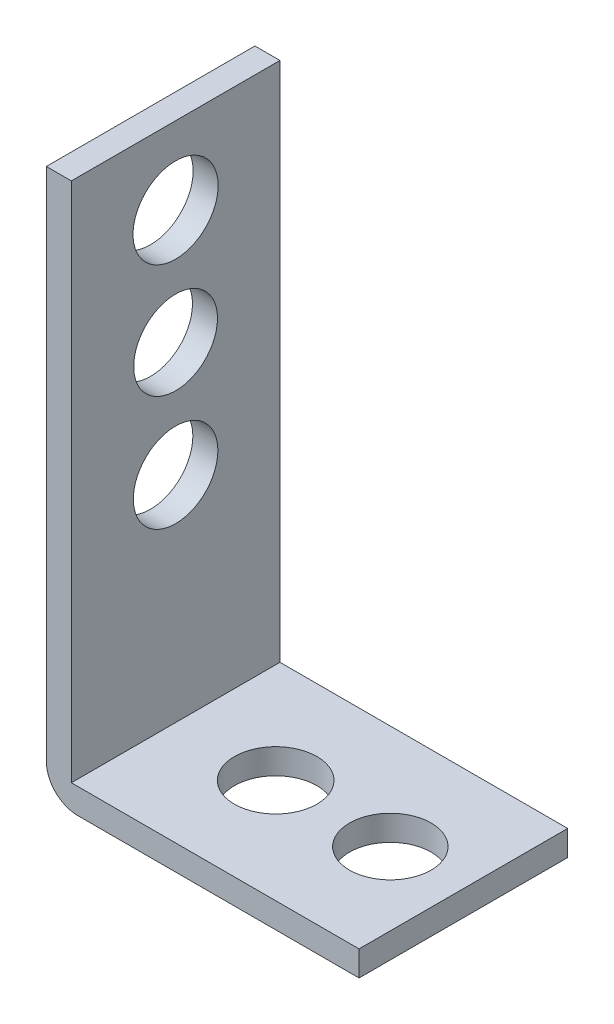
ISO-10303-21;
HEADER;
FILE_DESCRIPTION(('STEP AP214'),'2;1');
FILE_NAME('part.step','',(''),(''),'','','');
FILE_SCHEMA(('AUTOMOTIVE_DESIGN { 1 0 10303 214 1 1 1 1 }'));
ENDSEC;
DATA;
#1=APPLICATION_CONTEXT('core data for automotive mechanical design processes');
#2=APPLICATION_PROTOCOL_DEFINITION('international standard','automotive_design',2000,#1);
#3=PRODUCT_CONTEXT('',#1,'mechanical');
#4=PRODUCT('Part','Part','',(#3));
#5=PRODUCT_RELATED_PRODUCT_CATEGORY('part','',(#4));
#6=PRODUCT_DEFINITION_FORMATION('','',#4);
#7=PRODUCT_DEFINITION_CONTEXT('part definition',#1,'design');
#8=PRODUCT_DEFINITION('design','',#6,#7);
#9=PRODUCT_DEFINITION_SHAPE('','',#8);
#10=(LENGTH_UNIT() NAMED_UNIT(*) SI_UNIT(.MILLI.,.METRE.));
#11=(NAMED_UNIT(*) PLANE_ANGLE_UNIT() SI_UNIT($,.RADIAN.));
#12=(NAMED_UNIT(*) SI_UNIT($,.STERADIAN.) SOLID_ANGLE_UNIT());
#13=UNCERTAINTY_MEASURE_WITH_UNIT(LENGTH_MEASURE(1.E-05),#10,'distance_accuracy_value','');
#14=(GEOMETRIC_REPRESENTATION_CONTEXT(3) GLOBAL_UNCERTAINTY_ASSIGNED_CONTEXT((#13)) GLOBAL_UNIT_ASSIGNED_CONTEXT((#10,
#11,#12)) REPRESENTATION_CONTEXT('',''));
#15=CARTESIAN_POINT('',(0.,0.,0.));
#16=DIRECTION('',(0.,0.,1.));
#17=DIRECTION('',(1.,0.,0.));
#18=AXIS2_PLACEMENT_3D('',#15,#16,#17);
#19=CARTESIAN_POINT('',(0.,3.0734,0.));
#20=DIRECTION('',(0.,1.,0.));
#21=DIRECTION('',(0.,0.,1.));
#22=AXIS2_PLACEMENT_3D('',#19,#20,#21);
#23=PLANE('',#22);
#24=CARTESIAN_POINT('',(-8.89,3.0734,-12.7));
#25=DIRECTION('',(0.,1.,0.));
#26=DIRECTION('',(0.,0.,1.));
#27=AXIS2_PLACEMENT_3D('',#24,#25,#26);
#28=CIRCLE('',#27,4.97437478473373);
#29=CARTESIAN_POINT('',(-8.89,3.0734,-7.72562521526627));
#30=VERTEX_POINT('',#29);
#31=EDGE_CURVE('E187',#30,#30,#28,.T.);
#32=ORIENTED_EDGE('',*,*,#31,.F.);
#33=EDGE_LOOP('',(#32));
#34=FACE_BOUND('',#33,.T.);
#35=CARTESIAN_POINT('',(-22.86,3.0734,-12.7));
#36=DIRECTION('',(0.,1.,0.));
#37=DIRECTION('',(0.,0.,1.));
#38=AXIS2_PLACEMENT_3D('',#35,#36,#37);
#39=CIRCLE('',#38,5.02726263418644);
#40=CARTESIAN_POINT('',(-22.86,3.0734,-7.67273736581356));
#41=VERTEX_POINT('',#40);
#42=EDGE_CURVE('E174',#41,#41,#39,.T.);
#43=ORIENTED_EDGE('',*,*,#42,.F.);
#44=EDGE_LOOP('',(#43));
#45=FACE_BOUND('',#44,.T.);
#46=DIRECTION('',(-1.,0.,0.));
#47=VECTOR('',#46,1.);
#48=CARTESIAN_POINT('',(0.,3.0734,-25.4151651382699));
#49=LINE('',#48,#47);
#50=CARTESIAN_POINT('',(0.,3.0734,-25.4151651382699));
#51=VERTEX_POINT('',#50);
#52=CARTESIAN_POINT('',(-35.052,3.0734,-25.4151651382699));
#53=VERTEX_POINT('',#52);
#54=EDGE_CURVE('E127',#51,#53,#49,.T.);
#55=ORIENTED_EDGE('',*,*,#54,.T.);
#56=DIRECTION('',(0.,0.,1.));
#57=VECTOR('',#56,1.);
#58=CARTESIAN_POINT('',(-35.052,3.0734,-25.4151651382699));
#59=LINE('',#58,#57);
#60=CARTESIAN_POINT('',(-35.052,3.0734,0.));
#61=VERTEX_POINT('',#60);
#62=EDGE_CURVE('E116',#53,#61,#59,.T.);
#63=ORIENTED_EDGE('',*,*,#62,.T.);
#64=DIRECTION('',(1.,0.,0.));
#65=VECTOR('',#64,1.);
#66=CARTESIAN_POINT('',(0.,3.0734,0.));
#67=LINE('',#66,#65);
#68=CARTESIAN_POINT('',(0.,3.0734,0.));
#69=VERTEX_POINT('',#68);
#70=EDGE_CURVE('E131',#61,#69,#67,.T.);
#71=ORIENTED_EDGE('',*,*,#70,.T.);
#72=DIRECTION('',(0.,0.,-1.));
#73=VECTOR('',#72,1.);
#74=CARTESIAN_POINT('',(0.,3.0734,0.));
#75=LINE('',#74,#73);
#76=EDGE_CURVE('E124',#69,#51,#75,.T.);
#77=ORIENTED_EDGE('',*,*,#76,.T.);
#78=EDGE_LOOP('',(#55,#63,#71,#77));
#79=FACE_BOUND('',#78,.T.);
#80=ADVANCED_FACE('F33',(#34,#45,#79),#23,.T.);
#81=CARTESIAN_POINT('',(0.,3.0734,0.));
#82=DIRECTION('',(-1.,0.,0.));
#83=DIRECTION('',(0.,0.,1.));
#84=AXIS2_PLACEMENT_3D('',#81,#82,#83);
#85=PLANE('',#84);
#86=DIRECTION('',(0.,0.,-1.));
#87=VECTOR('',#86,1.);
#88=CARTESIAN_POINT('',(0.,0.,0.));
#89=LINE('',#88,#87);
#90=CARTESIAN_POINT('',(0.,0.,0.));
#91=VERTEX_POINT('',#90);
#92=CARTESIAN_POINT('',(0.,0.,-25.4151651382699));
#93=VERTEX_POINT('',#92);
#94=EDGE_CURVE('E123',#91,#93,#89,.T.);
#95=ORIENTED_EDGE('',*,*,#94,.T.);
#96=DIRECTION('',(0.,-1.,0.));
#97=VECTOR('',#96,1.);
#98=CARTESIAN_POINT('',(0.,3.0734,-25.4151651382699));
#99=LINE('',#98,#97);
#100=EDGE_CURVE('E141',#51,#93,#99,.T.);
#101=ORIENTED_EDGE('',*,*,#100,.F.);
#102=ORIENTED_EDGE('',*,*,#76,.F.);
#103=DIRECTION('',(0.,-1.,0.));
#104=VECTOR('',#103,1.);
#105=CARTESIAN_POINT('',(0.,3.0734,0.));
#106=LINE('',#105,#104);
#107=EDGE_CURVE('E99',#69,#91,#106,.T.);
#108=ORIENTED_EDGE('',*,*,#107,.T.);
#109=EDGE_LOOP('',(#95,#101,#102,#108));
#110=FACE_BOUND('',#109,.T.);
#111=ADVANCED_FACE('F152',(#110),#85,.F.);
#112=CARTESIAN_POINT('',(0.,3.0734,-25.4151651382699));
#113=DIRECTION('',(0.,0.,1.));
#114=DIRECTION('',(1.,0.,0.));
#115=AXIS2_PLACEMENT_3D('',#112,#113,#114);
#116=PLANE('',#115);
#117=DIRECTION('',(-1.,0.,0.));
#118=VECTOR('',#117,1.);
#119=CARTESIAN_POINT('',(0.,0.,-25.4151651382699));
#120=LINE('',#119,#118);
#121=CARTESIAN_POINT('',(-34.29,0.,-25.4151651382699));
#122=VERTEX_POINT('',#121);
#123=EDGE_CURVE('E135',#93,#122,#120,.T.);
#124=ORIENTED_EDGE('',*,*,#123,.T.);
#125=CARTESIAN_POINT('',(-34.29,3.81,-25.4151651382699));
#126=DIRECTION('',(0.,0.,1.));
#127=DIRECTION('',(1.,0.,0.));
#128=AXIS2_PLACEMENT_3D('',#125,#126,#127);
#129=CIRCLE('',#128,3.81);
#130=CARTESIAN_POINT('',(-38.1,3.81,-25.4151651382699));
#131=VERTEX_POINT('',#130);
#132=EDGE_CURVE('E11',#122,#131,#129,.F.);
#133=ORIENTED_EDGE('',*,*,#132,.T.);
#134=DIRECTION('',(0.,-1.,0.));
#135=VECTOR('',#134,1.);
#136=CARTESIAN_POINT('',(-38.1,3.0734,-25.4151651382699));
#137=LINE('',#136,#135);
#138=CARTESIAN_POINT('',(-38.1,66.5734,-25.4151651382699));
#139=VERTEX_POINT('',#138);
#140=EDGE_CURVE('E98',#139,#131,#137,.T.);
#141=ORIENTED_EDGE('',*,*,#140,.F.);
#142=DIRECTION('',(-1.,0.,0.));
#143=VECTOR('',#142,1.);
#144=CARTESIAN_POINT('',(-35.052,66.5734,-25.4151651382699));
#145=LINE('',#144,#143);
#146=CARTESIAN_POINT('',(-35.052,66.5734,-25.4151651382699));
#147=VERTEX_POINT('',#146);
#148=EDGE_CURVE('E112',#147,#139,#145,.T.);
#149=ORIENTED_EDGE('',*,*,#148,.F.);
#150=DIRECTION('',(0.,-1.,0.));
#151=VECTOR('',#150,1.);
#152=CARTESIAN_POINT('',(-35.052,3.0734,-25.4151651382699));
#153=LINE('',#152,#151);
#154=EDGE_CURVE('E113',#147,#53,#153,.T.);
#155=ORIENTED_EDGE('',*,*,#154,.T.);
#156=ORIENTED_EDGE('',*,*,#54,.F.);
#157=ORIENTED_EDGE('',*,*,#100,.T.);
#158=EDGE_LOOP('',(#124,#133,#141,#149,#155,#156,#157));
#159=FACE_BOUND('',#158,.T.);
#160=ADVANCED_FACE('F147',(#159),#116,.F.);
#161=CARTESIAN_POINT('',(-38.1,3.0734,0.));
#162=DIRECTION('',(1.,0.,0.));
#163=DIRECTION('',(0.,0.,-1.));
#164=AXIS2_PLACEMENT_3D('',#161,#162,#163);
#165=PLANE('',#164);
#166=CARTESIAN_POINT('',(-38.1,43.18,-12.7));
#167=DIRECTION('',(1.,0.,0.));
#168=DIRECTION('',(0.,0.,-1.));
#169=AXIS2_PLACEMENT_3D('',#166,#167,#168);
#170=CIRCLE('',#169,5.10536442863874);
#171=CARTESIAN_POINT('',(-38.1,43.18,-17.8053644286387));
#172=VERTEX_POINT('',#171);
#173=EDGE_CURVE('E167',#172,#172,#170,.T.);
#174=ORIENTED_EDGE('',*,*,#173,.T.);
#175=EDGE_LOOP('',(#174));
#176=FACE_BOUND('',#175,.T.);
#177=CARTESIAN_POINT('',(-38.1,29.21,-12.7));
#178=DIRECTION('',(1.,0.,0.));
#179=DIRECTION('',(0.,0.,-1.));
#180=AXIS2_PLACEMENT_3D('',#177,#178,#179);
#181=CIRCLE('',#180,5.1516488627561);
#182=CARTESIAN_POINT('',(-38.1,29.21,-17.8516488627561));
#183=VERTEX_POINT('',#182);
#184=EDGE_CURVE('E173',#183,#183,#181,.T.);
#185=ORIENTED_EDGE('',*,*,#184,.T.);
#186=EDGE_LOOP('',(#185));
#187=FACE_BOUND('',#186,.T.);
#188=CARTESIAN_POINT('',(-38.1,57.15,-12.7));
#189=DIRECTION('',(1.,0.,0.));
#190=DIRECTION('',(0.,0.,-1.));
#191=AXIS2_PLACEMENT_3D('',#188,#189,#190);
#192=CIRCLE('',#191,5.18573654494451);
#193=CARTESIAN_POINT('',(-38.1,57.15,-17.8857365449445));
#194=VERTEX_POINT('',#193);
#195=EDGE_CURVE('E163',#194,#194,#192,.T.);
#196=ORIENTED_EDGE('',*,*,#195,.T.);
#197=EDGE_LOOP('',(#196));
#198=FACE_BOUND('',#197,.T.);
#199=ORIENTED_EDGE('',*,*,#140,.T.);
#200=DIRECTION('',(0.,0.,1.));
#201=VECTOR('',#200,1.);
#202=CARTESIAN_POINT('',(-38.1,3.81,0.));
#203=LINE('',#202,#201);
#204=CARTESIAN_POINT('',(-38.1,3.81,0.));
#205=VERTEX_POINT('',#204);
#206=EDGE_CURVE('E97',#131,#205,#203,.T.);
#207=ORIENTED_EDGE('',*,*,#206,.T.);
#208=DIRECTION('',(0.,-1.,0.));
#209=VECTOR('',#208,1.);
#210=CARTESIAN_POINT('',(-38.1,3.0734,0.));
#211=LINE('',#210,#209);
#212=CARTESIAN_POINT('',(-38.1,66.5734,0.));
#213=VERTEX_POINT('',#212);
#214=EDGE_CURVE('E89',#213,#205,#211,.T.);
#215=ORIENTED_EDGE('',*,*,#214,.F.);
#216=DIRECTION('',(0.,0.,-1.));
#217=VECTOR('',#216,1.);
#218=CARTESIAN_POINT('',(-38.1,66.5734,-25.4151651382699));
#219=LINE('',#218,#217);
#220=EDGE_CURVE('E94',#213,#139,#219,.T.);
#221=ORIENTED_EDGE('',*,*,#220,.T.);
#222=EDGE_LOOP('',(#199,#207,#215,#221));
#223=FACE_BOUND('',#222,.T.);
#224=ADVANCED_FACE('F92',(#176,#187,#198,#223),#165,.F.);
#225=CARTESIAN_POINT('',(0.,3.0734,0.));
#226=DIRECTION('',(0.,0.,-1.));
#227=DIRECTION('',(-1.,0.,0.));
#228=AXIS2_PLACEMENT_3D('',#225,#226,#227);
#229=PLANE('',#228);
#230=ORIENTED_EDGE('',*,*,#214,.T.);
#231=CARTESIAN_POINT('',(-34.29,3.81,0.));
#232=DIRECTION('',(0.,0.,-1.));
#233=DIRECTION('',(-1.,0.,0.));
#234=AXIS2_PLACEMENT_3D('',#231,#232,#233);
#235=CIRCLE('',#234,3.81);
#236=CARTESIAN_POINT('',(-34.29,0.,0.));
#237=VERTEX_POINT('',#236);
#238=EDGE_CURVE('E55',#205,#237,#235,.F.);
#239=ORIENTED_EDGE('',*,*,#238,.T.);
#240=DIRECTION('',(1.,0.,0.));
#241=VECTOR('',#240,1.);
#242=CARTESIAN_POINT('',(0.,0.,0.));
#243=LINE('',#242,#241);
#244=EDGE_CURVE('E128',#237,#91,#243,.T.);
#245=ORIENTED_EDGE('',*,*,#244,.T.);
#246=ORIENTED_EDGE('',*,*,#107,.F.);
#247=ORIENTED_EDGE('',*,*,#70,.F.);
#248=DIRECTION('',(0.,1.,0.));
#249=VECTOR('',#248,1.);
#250=CARTESIAN_POINT('',(-35.052,3.0734,0.));
#251=LINE('',#250,#249);
#252=CARTESIAN_POINT('',(-35.052,66.5734,0.));
#253=VERTEX_POINT('',#252);
#254=EDGE_CURVE('E105',#61,#253,#251,.T.);
#255=ORIENTED_EDGE('',*,*,#254,.T.);
#256=DIRECTION('',(1.,0.,0.));
#257=VECTOR('',#256,1.);
#258=CARTESIAN_POINT('',(-38.1,66.5734,0.));
#259=LINE('',#258,#257);
#260=EDGE_CURVE('E102',#213,#253,#259,.T.);
#261=ORIENTED_EDGE('',*,*,#260,.F.);
#262=EDGE_LOOP('',(#230,#239,#245,#246,#247,#255,#261));
#263=FACE_BOUND('',#262,.T.);
#264=ADVANCED_FACE('F103',(#263),#229,.F.);
#265=CARTESIAN_POINT('',(0.,0.,0.));
#266=DIRECTION('',(0.,1.,0.));
#267=DIRECTION('',(0.,0.,1.));
#268=AXIS2_PLACEMENT_3D('',#265,#266,#267);
#269=PLANE('',#268);
#270=CARTESIAN_POINT('',(-8.89,0.,-12.7));
#271=DIRECTION('',(0.,-1.,0.));
#272=DIRECTION('',(0.,0.,-1.));
#273=AXIS2_PLACEMENT_3D('',#270,#271,#272);
#274=CIRCLE('',#273,4.97437478473373);
#275=CARTESIAN_POINT('',(-8.89,0.,-17.6743747847337));
#276=VERTEX_POINT('',#275);
#277=EDGE_CURVE('E190',#276,#276,#274,.T.);
#278=ORIENTED_EDGE('',*,*,#277,.F.);
#279=EDGE_LOOP('',(#278));
#280=FACE_BOUND('',#279,.T.);
#281=CARTESIAN_POINT('',(-22.86,0.,-12.7));
#282=DIRECTION('',(0.,-1.,0.));
#283=DIRECTION('',(0.,0.,-1.));
#284=AXIS2_PLACEMENT_3D('',#281,#282,#283);
#285=CIRCLE('',#284,5.02726263418644);
#286=CARTESIAN_POINT('',(-22.86,0.,-17.7272626341864));
#287=VERTEX_POINT('',#286);
#288=EDGE_CURVE('E184',#287,#287,#285,.T.);
#289=ORIENTED_EDGE('',*,*,#288,.F.);
#290=EDGE_LOOP('',(#289));
#291=FACE_BOUND('',#290,.T.);
#292=ORIENTED_EDGE('',*,*,#244,.F.);
#293=DIRECTION('',(0.,0.,1.));
#294=VECTOR('',#293,1.);
#295=CARTESIAN_POINT('',(-34.29,0.,0.));
#296=LINE('',#295,#294);
#297=EDGE_CURVE('E41',#237,#122,#296,.F.);
#298=ORIENTED_EDGE('',*,*,#297,.T.);
#299=ORIENTED_EDGE('',*,*,#123,.F.);
#300=ORIENTED_EDGE('',*,*,#94,.F.);
#301=EDGE_LOOP('',(#292,#298,#299,#300));
#302=FACE_BOUND('',#301,.T.);
#303=ADVANCED_FACE('F154',(#280,#291,#302),#269,.F.);
#304=CARTESIAN_POINT('',(-35.052,66.5734,-25.4151651382699));
#305=DIRECTION('',(0.,1.,0.));
#306=DIRECTION('',(0.,0.,1.));
#307=AXIS2_PLACEMENT_3D('',#304,#305,#306);
#308=PLANE('',#307);
#309=ORIENTED_EDGE('',*,*,#260,.T.);
#310=DIRECTION('',(0.,0.,-1.));
#311=VECTOR('',#310,1.);
#312=CARTESIAN_POINT('',(-35.052,66.5734,-25.4151651382699));
#313=LINE('',#312,#311);
#314=EDGE_CURVE('E120',#253,#147,#313,.T.);
#315=ORIENTED_EDGE('',*,*,#314,.T.);
#316=ORIENTED_EDGE('',*,*,#148,.T.);
#317=ORIENTED_EDGE('',*,*,#220,.F.);
#318=EDGE_LOOP('',(#309,#315,#316,#317));
#319=FACE_BOUND('',#318,.T.);
#320=ADVANCED_FACE('F110',(#319),#308,.T.);
#321=CARTESIAN_POINT('',(-35.052,0.,0.));
#322=DIRECTION('',(1.,0.,0.));
#323=DIRECTION('',(0.,0.,-1.));
#324=AXIS2_PLACEMENT_3D('',#321,#322,#323);
#325=PLANE('',#324);
#326=CARTESIAN_POINT('',(-35.052,43.18,-12.7));
#327=DIRECTION('',(1.,0.,0.));
#328=DIRECTION('',(0.,0.,-1.));
#329=AXIS2_PLACEMENT_3D('',#326,#327,#328);
#330=CIRCLE('',#329,5.10536442863874);
#331=CARTESIAN_POINT('',(-35.052,43.18,-17.8053644286387));
#332=VERTEX_POINT('',#331);
#333=EDGE_CURVE('E177',#332,#332,#330,.T.);
#334=ORIENTED_EDGE('',*,*,#333,.F.);
#335=EDGE_LOOP('',(#334));
#336=FACE_BOUND('',#335,.T.);
#337=CARTESIAN_POINT('',(-35.052,29.21,-12.7));
#338=DIRECTION('',(1.,0.,0.));
#339=DIRECTION('',(0.,0.,-1.));
#340=AXIS2_PLACEMENT_3D('',#337,#338,#339);
#341=CIRCLE('',#340,5.1516488627561);
#342=CARTESIAN_POINT('',(-35.052,29.21,-17.8516488627561));
#343=VERTEX_POINT('',#342);
#344=EDGE_CURVE('E170',#343,#343,#341,.T.);
#345=ORIENTED_EDGE('',*,*,#344,.F.);
#346=EDGE_LOOP('',(#345));
#347=FACE_BOUND('',#346,.T.);
#348=CARTESIAN_POINT('',(-35.052,57.15,-12.7));
#349=DIRECTION('',(1.,0.,0.));
#350=DIRECTION('',(0.,0.,-1.));
#351=AXIS2_PLACEMENT_3D('',#348,#349,#350);
#352=CIRCLE('',#351,5.18573654494451);
#353=CARTESIAN_POINT('',(-35.052,57.15,-17.8857365449445));
#354=VERTEX_POINT('',#353);
#355=EDGE_CURVE('E164',#354,#354,#352,.T.);
#356=ORIENTED_EDGE('',*,*,#355,.F.);
#357=EDGE_LOOP('',(#356));
#358=FACE_BOUND('',#357,.T.);
#359=ORIENTED_EDGE('',*,*,#254,.F.);
#360=ORIENTED_EDGE('',*,*,#62,.F.);
#361=ORIENTED_EDGE('',*,*,#154,.F.);
#362=ORIENTED_EDGE('',*,*,#314,.F.);
#363=EDGE_LOOP('',(#359,#360,#361,#362));
#364=FACE_BOUND('',#363,.T.);
#365=ADVANCED_FACE('F158',(#336,#347,#358,#364),#325,.T.);
#366=CARTESIAN_POINT('',(-34.29,3.81,0.));
#367=DIRECTION('',(0.,0.,1.));
#368=DIRECTION('',(1.,0.,0.));
#369=AXIS2_PLACEMENT_3D('',#366,#367,#368);
#370=CYLINDRICAL_SURFACE('',#369,3.81);
#371=ORIENTED_EDGE('',*,*,#132,.F.);
#372=ORIENTED_EDGE('',*,*,#297,.F.);
#373=ORIENTED_EDGE('',*,*,#238,.F.);
#374=ORIENTED_EDGE('',*,*,#206,.F.);
#375=EDGE_LOOP('',(#371,#372,#373,#374));
#376=FACE_BOUND('',#375,.T.);
#377=ADVANCED_FACE('F35',(#376),#370,.T.);
#378=CARTESIAN_POINT('',(-38.1,57.15,-12.7));
#379=DIRECTION('',(1.,0.,0.));
#380=DIRECTION('',(0.,0.,-1.));
#381=AXIS2_PLACEMENT_3D('',#378,#379,#380);
#382=CYLINDRICAL_SURFACE('',#381,5.18573654494451);
#383=ORIENTED_EDGE('',*,*,#195,.F.);
#384=EDGE_LOOP('',(#383));
#385=FACE_BOUND('',#384,.T.);
#386=ORIENTED_EDGE('',*,*,#355,.T.);
#387=EDGE_LOOP('',(#386));
#388=FACE_BOUND('',#387,.T.);
#389=ADVANCED_FACE('F266',(#385,#388),#382,.F.);
#390=CARTESIAN_POINT('',(-38.1,29.21,-12.7));
#391=DIRECTION('',(1.,0.,0.));
#392=DIRECTION('',(0.,0.,-1.));
#393=AXIS2_PLACEMENT_3D('',#390,#391,#392);
#394=CYLINDRICAL_SURFACE('',#393,5.1516488627561);
#395=ORIENTED_EDGE('',*,*,#184,.F.);
#396=EDGE_LOOP('',(#395));
#397=FACE_BOUND('',#396,.T.);
#398=ORIENTED_EDGE('',*,*,#344,.T.);
#399=EDGE_LOOP('',(#398));
#400=FACE_BOUND('',#399,.T.);
#401=ADVANCED_FACE('F212',(#397,#400),#394,.F.);
#402=CARTESIAN_POINT('',(-38.1,43.18,-12.7));
#403=DIRECTION('',(1.,0.,0.));
#404=DIRECTION('',(0.,0.,-1.));
#405=AXIS2_PLACEMENT_3D('',#402,#403,#404);
#406=CYLINDRICAL_SURFACE('',#405,5.10536442863874);
#407=ORIENTED_EDGE('',*,*,#173,.F.);
#408=EDGE_LOOP('',(#407));
#409=FACE_BOUND('',#408,.T.);
#410=ORIENTED_EDGE('',*,*,#333,.T.);
#411=EDGE_LOOP('',(#410));
#412=FACE_BOUND('',#411,.T.);
#413=ADVANCED_FACE('F203',(#409,#412),#406,.F.);
#414=CARTESIAN_POINT('',(-22.86,3.556,-12.7));
#415=DIRECTION('',(0.,-1.,0.));
#416=DIRECTION('',(0.,0.,-1.));
#417=AXIS2_PLACEMENT_3D('',#414,#415,#416);
#418=CYLINDRICAL_SURFACE('',#417,5.02726263418644);
#419=ORIENTED_EDGE('',*,*,#42,.T.);
#420=EDGE_LOOP('',(#419));
#421=FACE_BOUND('',#420,.T.);
#422=ORIENTED_EDGE('',*,*,#288,.T.);
#423=EDGE_LOOP('',(#422));
#424=FACE_BOUND('',#423,.T.);
#425=ADVANCED_FACE('F201',(#421,#424),#418,.F.);
#426=CARTESIAN_POINT('',(-8.89,3.556,-12.7));
#427=DIRECTION('',(0.,-1.,0.));
#428=DIRECTION('',(0.,0.,-1.));
#429=AXIS2_PLACEMENT_3D('',#426,#427,#428);
#430=CYLINDRICAL_SURFACE('',#429,4.97437478473373);
#431=ORIENTED_EDGE('',*,*,#31,.T.);
#432=EDGE_LOOP('',(#431));
#433=FACE_BOUND('',#432,.T.);
#434=ORIENTED_EDGE('',*,*,#277,.T.);
#435=EDGE_LOOP('',(#434));
#436=FACE_BOUND('',#435,.T.);
#437=ADVANCED_FACE('F194',(#433,#436),#430,.F.);
#438=CLOSED_SHELL('',(#80,#111,#160,#224,#264,#303,#320,#365,#377,#389,#401,#413,#425,#437));
#439=MANIFOLD_SOLID_BREP('B2',#438);
#440=ADVANCED_BREP_SHAPE_REPRESENTATION('',(#18,#439),#14);
#441=SHAPE_DEFINITION_REPRESENTATION(#9,#440);
ENDSEC;
END-ISO-10303-21;
